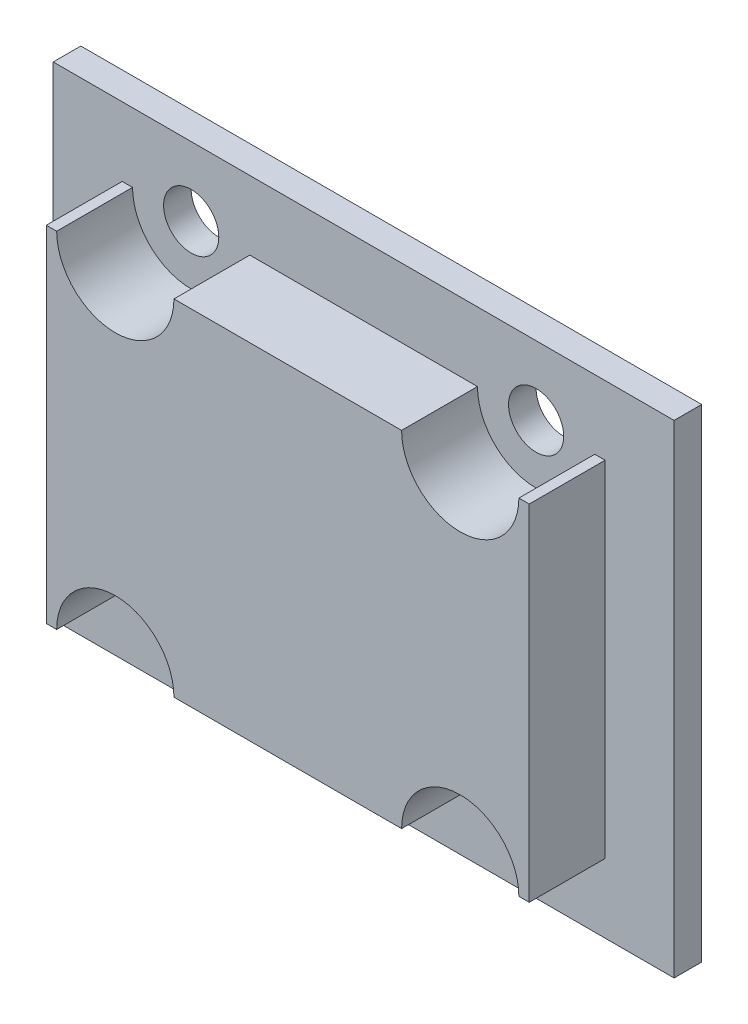
ISO-10303-21;
HEADER;
FILE_DESCRIPTION(('STEP AP214'),'2;1');
FILE_NAME('part.step','',(''),(''),'','','');
FILE_SCHEMA(('AUTOMOTIVE_DESIGN { 1 0 10303 214 1 1 1 1 }'));
ENDSEC;
DATA;
#1=APPLICATION_CONTEXT('core data for automotive mechanical design processes');
#2=APPLICATION_PROTOCOL_DEFINITION('international standard','automotive_design',2000,#1);
#3=PRODUCT_CONTEXT('',#1,'mechanical');
#4=PRODUCT('Part','Part','',(#3));
#5=PRODUCT_RELATED_PRODUCT_CATEGORY('part','',(#4));
#6=PRODUCT_DEFINITION_FORMATION('','',#4);
#7=PRODUCT_DEFINITION_CONTEXT('part definition',#1,'design');
#8=PRODUCT_DEFINITION('design','',#6,#7);
#9=PRODUCT_DEFINITION_SHAPE('','',#8);
#10=(LENGTH_UNIT() NAMED_UNIT(*) SI_UNIT(.MILLI.,.METRE.));
#11=(NAMED_UNIT(*) PLANE_ANGLE_UNIT() SI_UNIT($,.RADIAN.));
#12=(NAMED_UNIT(*) SI_UNIT($,.STERADIAN.) SOLID_ANGLE_UNIT());
#13=UNCERTAINTY_MEASURE_WITH_UNIT(LENGTH_MEASURE(1.E-05),#10,'distance_accuracy_value','');
#14=(GEOMETRIC_REPRESENTATION_CONTEXT(3) GLOBAL_UNCERTAINTY_ASSIGNED_CONTEXT((#13)) GLOBAL_UNIT_ASSIGNED_CONTEXT((#10,
#11,#12)) REPRESENTATION_CONTEXT('',''));
#15=CARTESIAN_POINT('',(0.,0.,0.));
#16=DIRECTION('',(0.,0.,1.));
#17=DIRECTION('',(1.,0.,0.));
#18=AXIS2_PLACEMENT_3D('',#15,#16,#17);
#19=CARTESIAN_POINT('',(0.,0.,19.));
#20=DIRECTION('',(0.,0.,1.));
#21=DIRECTION('',(1.,0.,0.));
#22=AXIS2_PLACEMENT_3D('',#19,#20,#21);
#23=PLANE('',#22);
#24=DIRECTION('',(-1.,0.,0.));
#25=VECTOR('',#24,1.);
#26=CARTESIAN_POINT('',(14.,10.,19.));
#27=LINE('',#26,#25);
#28=CARTESIAN_POINT('',(-13.4,10.,19.));
#29=VERTEX_POINT('',#28);
#30=CARTESIAN_POINT('',(-14.,10.,19.));
#31=VERTEX_POINT('',#30);
#32=EDGE_CURVE('E23',#29,#31,#27,.T.);
#33=ORIENTED_EDGE('',*,*,#32,.T.);
#34=DIRECTION('',(0.,-1.,0.));
#35=VECTOR('',#34,1.);
#36=CARTESIAN_POINT('',(-14.,10.,19.));
#37=LINE('',#36,#35);
#38=CARTESIAN_POINT('',(-14.,-10.,19.));
#39=VERTEX_POINT('',#38);
#40=EDGE_CURVE('E9',#31,#39,#37,.T.);
#41=ORIENTED_EDGE('',*,*,#40,.T.);
#42=DIRECTION('',(1.,0.,0.));
#43=VECTOR('',#42,1.);
#44=CARTESIAN_POINT('',(-14.,-10.,19.));
#45=LINE('',#44,#43);
#46=CARTESIAN_POINT('',(-13.4,-10.,19.));
#47=VERTEX_POINT('',#46);
#48=EDGE_CURVE('E249',#39,#47,#45,.T.);
#49=ORIENTED_EDGE('',*,*,#48,.T.);
#50=CARTESIAN_POINT('',(-10.,-10.,19.));
#51=DIRECTION('',(0.,0.,-1.));
#52=DIRECTION('',(1.,0.,0.));
#53=AXIS2_PLACEMENT_3D('',#50,#51,#52);
#54=CIRCLE('',#53,3.4);
#55=CARTESIAN_POINT('',(-6.6,-10.,19.));
#56=VERTEX_POINT('',#55);
#57=EDGE_CURVE('E337',#47,#56,#54,.T.);
#58=ORIENTED_EDGE('',*,*,#57,.T.);
#59=DIRECTION('',(1.,0.,0.));
#60=VECTOR('',#59,1.);
#61=CARTESIAN_POINT('',(-14.,-10.,19.));
#62=LINE('',#61,#60);
#63=CARTESIAN_POINT('',(6.6,-10.,19.));
#64=VERTEX_POINT('',#63);
#65=EDGE_CURVE('E234',#56,#64,#62,.T.);
#66=ORIENTED_EDGE('',*,*,#65,.T.);
#67=CARTESIAN_POINT('',(10.,-10.,19.));
#68=DIRECTION('',(0.,0.,-1.));
#69=DIRECTION('',(1.,0.,0.));
#70=AXIS2_PLACEMENT_3D('',#67,#68,#69);
#71=CIRCLE('',#70,3.4);
#72=CARTESIAN_POINT('',(13.4,-10.,19.));
#73=VERTEX_POINT('',#72);
#74=EDGE_CURVE('E375',#64,#73,#71,.T.);
#75=ORIENTED_EDGE('',*,*,#74,.T.);
#76=DIRECTION('',(1.,0.,0.));
#77=VECTOR('',#76,1.);
#78=CARTESIAN_POINT('',(-14.,-10.,19.));
#79=LINE('',#78,#77);
#80=CARTESIAN_POINT('',(14.,-10.,19.));
#81=VERTEX_POINT('',#80);
#82=EDGE_CURVE('E379',#73,#81,#79,.T.);
#83=ORIENTED_EDGE('',*,*,#82,.T.);
#84=DIRECTION('',(0.,1.,0.));
#85=VECTOR('',#84,1.);
#86=CARTESIAN_POINT('',(14.,-10.,19.));
#87=LINE('',#86,#85);
#88=CARTESIAN_POINT('',(14.,10.,19.));
#89=VERTEX_POINT('',#88);
#90=EDGE_CURVE('E389',#81,#89,#87,.T.);
#91=ORIENTED_EDGE('',*,*,#90,.T.);
#92=DIRECTION('',(-1.,0.,0.));
#93=VECTOR('',#92,1.);
#94=CARTESIAN_POINT('',(14.,10.,19.));
#95=LINE('',#94,#93);
#96=CARTESIAN_POINT('',(13.4,10.,19.));
#97=VERTEX_POINT('',#96);
#98=EDGE_CURVE('E396',#89,#97,#95,.T.);
#99=ORIENTED_EDGE('',*,*,#98,.T.);
#100=CARTESIAN_POINT('',(10.,10.,19.));
#101=DIRECTION('',(0.,0.,-1.));
#102=DIRECTION('',(1.,0.,0.));
#103=AXIS2_PLACEMENT_3D('',#100,#101,#102);
#104=CIRCLE('',#103,3.4);
#105=CARTESIAN_POINT('',(6.6,10.,19.));
#106=VERTEX_POINT('',#105);
#107=EDGE_CURVE('E403',#97,#106,#104,.T.);
#108=ORIENTED_EDGE('',*,*,#107,.T.);
#109=DIRECTION('',(-1.,0.,0.));
#110=VECTOR('',#109,1.);
#111=CARTESIAN_POINT('',(14.,10.,19.));
#112=LINE('',#111,#110);
#113=CARTESIAN_POINT('',(-6.6,10.,19.));
#114=VERTEX_POINT('',#113);
#115=EDGE_CURVE('E411',#106,#114,#112,.T.);
#116=ORIENTED_EDGE('',*,*,#115,.T.);
#117=CARTESIAN_POINT('',(-10.,10.,19.));
#118=DIRECTION('',(0.,0.,-1.));
#119=DIRECTION('',(1.,0.,0.));
#120=AXIS2_PLACEMENT_3D('',#117,#118,#119);
#121=CIRCLE('',#120,3.4);
#122=EDGE_CURVE('E416',#114,#29,#121,.T.);
#123=ORIENTED_EDGE('',*,*,#122,.T.);
#124=EDGE_LOOP('',(#33,#41,#49,#58,#66,#75,#83,#91,#99,#108,#116,#123));
#125=FACE_BOUND('',#124,.T.);
#126=ADVANCED_FACE('F15',(#125),#23,.T.);
#127=CARTESIAN_POINT('',(-14.,10.,14.6));
#128=DIRECTION('',(1.,0.,0.));
#129=DIRECTION('',(0.,1.,0.));
#130=AXIS2_PLACEMENT_3D('',#127,#128,#129);
#131=PLANE('',#130);
#132=DIRECTION('',(0.,-1.,0.));
#133=VECTOR('',#132,1.);
#134=CARTESIAN_POINT('',(-14.,10.,14.6));
#135=LINE('',#134,#133);
#136=CARTESIAN_POINT('',(-14.,10.,14.6));
#137=VERTEX_POINT('',#136);
#138=CARTESIAN_POINT('',(-14.,-10.,14.6));
#139=VERTEX_POINT('',#138);
#140=EDGE_CURVE('E298',#137,#139,#135,.T.);
#141=ORIENTED_EDGE('',*,*,#140,.T.);
#142=DIRECTION('',(0.,0.,1.));
#143=VECTOR('',#142,1.);
#144=CARTESIAN_POINT('',(-14.,-10.,14.6));
#145=LINE('',#144,#143);
#146=EDGE_CURVE('E255',#139,#39,#145,.T.);
#147=ORIENTED_EDGE('',*,*,#146,.T.);
#148=ORIENTED_EDGE('',*,*,#40,.F.);
#149=DIRECTION('',(0.,0.,1.));
#150=VECTOR('',#149,1.);
#151=CARTESIAN_POINT('',(-14.,10.,14.6));
#152=LINE('',#151,#150);
#153=EDGE_CURVE('E423',#137,#31,#152,.T.);
#154=ORIENTED_EDGE('',*,*,#153,.F.);
#155=EDGE_LOOP('',(#141,#147,#148,#154));
#156=FACE_BOUND('',#155,.T.);
#157=ADVANCED_FACE('F429',(#156),#131,.F.);
#158=CARTESIAN_POINT('',(14.,10.,14.6));
#159=DIRECTION('',(0.,-1.,0.));
#160=DIRECTION('',(0.,0.,-1.));
#161=AXIS2_PLACEMENT_3D('',#158,#159,#160);
#162=PLANE('',#161);
#163=ORIENTED_EDGE('',*,*,#153,.T.);
#164=ORIENTED_EDGE('',*,*,#32,.F.);
#165=DIRECTION('',(0.,0.,-1.));
#166=VECTOR('',#165,1.);
#167=CARTESIAN_POINT('',(-13.4,10.,13.));
#168=LINE('',#167,#166);
#169=CARTESIAN_POINT('',(-13.4,10.,14.6));
#170=VERTEX_POINT('',#169);
#171=EDGE_CURVE('E414',#29,#170,#168,.T.);
#172=ORIENTED_EDGE('',*,*,#171,.T.);
#173=DIRECTION('',(-1.,0.,0.));
#174=VECTOR('',#173,1.);
#175=CARTESIAN_POINT('',(14.,10.,14.6));
#176=LINE('',#175,#174);
#177=EDGE_CURVE('E309',#170,#137,#176,.T.);
#178=ORIENTED_EDGE('',*,*,#177,.T.);
#179=EDGE_LOOP('',(#163,#164,#172,#178));
#180=FACE_BOUND('',#179,.T.);
#181=ADVANCED_FACE('F430',(#180),#162,.F.);
#182=CARTESIAN_POINT('',(-10.,10.,13.));
#183=DIRECTION('',(0.,0.,-1.));
#184=DIRECTION('',(1.,0.,0.));
#185=AXIS2_PLACEMENT_3D('',#182,#183,#184);
#186=CYLINDRICAL_SURFACE('',#185,3.4);
#187=DIRECTION('',(0.,0.,1.));
#188=VECTOR('',#187,1.);
#189=CARTESIAN_POINT('',(-6.6,10.,13.));
#190=LINE('',#189,#188);
#191=CARTESIAN_POINT('',(-6.6,10.,14.6));
#192=VERTEX_POINT('',#191);
#193=EDGE_CURVE('E410',#192,#114,#190,.T.);
#194=ORIENTED_EDGE('',*,*,#193,.F.);
#195=CARTESIAN_POINT('',(-10.,10.,14.6));
#196=DIRECTION('',(0.,0.,-1.));
#197=DIRECTION('',(1.,0.,0.));
#198=AXIS2_PLACEMENT_3D('',#195,#196,#197);
#199=CIRCLE('',#198,3.4);
#200=EDGE_CURVE('E314',#192,#170,#199,.T.);
#201=ORIENTED_EDGE('',*,*,#200,.T.);
#202=ORIENTED_EDGE('',*,*,#171,.F.);
#203=ORIENTED_EDGE('',*,*,#122,.F.);
#204=EDGE_LOOP('',(#194,#201,#202,#203));
#205=FACE_BOUND('',#204,.T.);
#206=ADVANCED_FACE('F470',(#205),#186,.F.);
#207=CARTESIAN_POINT('',(14.,10.,14.6));
#208=DIRECTION('',(0.,-1.,0.));
#209=DIRECTION('',(0.,0.,-1.));
#210=AXIS2_PLACEMENT_3D('',#207,#208,#209);
#211=PLANE('',#210);
#212=ORIENTED_EDGE('',*,*,#193,.T.);
#213=ORIENTED_EDGE('',*,*,#115,.F.);
#214=DIRECTION('',(0.,0.,-1.));
#215=VECTOR('',#214,1.);
#216=CARTESIAN_POINT('',(6.6,10.,13.));
#217=LINE('',#216,#215);
#218=CARTESIAN_POINT('',(6.6,10.,14.6));
#219=VERTEX_POINT('',#218);
#220=EDGE_CURVE('E399',#106,#219,#217,.T.);
#221=ORIENTED_EDGE('',*,*,#220,.T.);
#222=DIRECTION('',(-1.,0.,0.));
#223=VECTOR('',#222,1.);
#224=CARTESIAN_POINT('',(14.,10.,14.6));
#225=LINE('',#224,#223);
#226=EDGE_CURVE('E318',#219,#192,#225,.T.);
#227=ORIENTED_EDGE('',*,*,#226,.T.);
#228=EDGE_LOOP('',(#212,#213,#221,#227));
#229=FACE_BOUND('',#228,.T.);
#230=ADVANCED_FACE('F463',(#229),#211,.F.);
#231=CARTESIAN_POINT('',(10.,10.,13.));
#232=DIRECTION('',(0.,0.,-1.));
#233=DIRECTION('',(1.,0.,0.));
#234=AXIS2_PLACEMENT_3D('',#231,#232,#233);
#235=CYLINDRICAL_SURFACE('',#234,3.4);
#236=DIRECTION('',(0.,0.,1.));
#237=VECTOR('',#236,1.);
#238=CARTESIAN_POINT('',(13.4,10.,13.));
#239=LINE('',#238,#237);
#240=CARTESIAN_POINT('',(13.4,10.,14.6));
#241=VERTEX_POINT('',#240);
#242=EDGE_CURVE('E392',#241,#97,#239,.T.);
#243=ORIENTED_EDGE('',*,*,#242,.F.);
#244=CARTESIAN_POINT('',(10.,10.,14.6));
#245=DIRECTION('',(0.,0.,-1.));
#246=DIRECTION('',(1.,0.,0.));
#247=AXIS2_PLACEMENT_3D('',#244,#245,#246);
#248=CIRCLE('',#247,3.4);
#249=EDGE_CURVE('E241',#241,#219,#248,.T.);
#250=ORIENTED_EDGE('',*,*,#249,.T.);
#251=ORIENTED_EDGE('',*,*,#220,.F.);
#252=ORIENTED_EDGE('',*,*,#107,.F.);
#253=EDGE_LOOP('',(#243,#250,#251,#252));
#254=FACE_BOUND('',#253,.T.);
#255=ADVANCED_FACE('F461',(#254),#235,.F.);
#256=CARTESIAN_POINT('',(14.,10.,14.6));
#257=DIRECTION('',(0.,-1.,0.));
#258=DIRECTION('',(0.,0.,-1.));
#259=AXIS2_PLACEMENT_3D('',#256,#257,#258);
#260=PLANE('',#259);
#261=ORIENTED_EDGE('',*,*,#242,.T.);
#262=ORIENTED_EDGE('',*,*,#98,.F.);
#263=DIRECTION('',(0.,0.,1.));
#264=VECTOR('',#263,1.);
#265=CARTESIAN_POINT('',(14.,10.,14.6));
#266=LINE('',#265,#264);
#267=CARTESIAN_POINT('',(14.,10.,14.6));
#268=VERTEX_POINT('',#267);
#269=EDGE_CURVE('E383',#268,#89,#266,.T.);
#270=ORIENTED_EDGE('',*,*,#269,.F.);
#271=DIRECTION('',(-1.,0.,0.));
#272=VECTOR('',#271,1.);
#273=CARTESIAN_POINT('',(14.,10.,14.6));
#274=LINE('',#273,#272);
#275=EDGE_CURVE('E240',#268,#241,#274,.T.);
#276=ORIENTED_EDGE('',*,*,#275,.T.);
#277=EDGE_LOOP('',(#261,#262,#270,#276));
#278=FACE_BOUND('',#277,.T.);
#279=ADVANCED_FACE('F456',(#278),#260,.F.);
#280=CARTESIAN_POINT('',(14.,-10.,14.6));
#281=DIRECTION('',(-1.,0.,0.));
#282=DIRECTION('',(0.,0.,1.));
#283=AXIS2_PLACEMENT_3D('',#280,#281,#282);
#284=PLANE('',#283);
#285=DIRECTION('',(0.,1.,0.));
#286=VECTOR('',#285,1.);
#287=CARTESIAN_POINT('',(14.,-10.,14.6));
#288=LINE('',#287,#286);
#289=CARTESIAN_POINT('',(14.,-10.,14.6));
#290=VERTEX_POINT('',#289);
#291=EDGE_CURVE('E239',#290,#268,#288,.T.);
#292=ORIENTED_EDGE('',*,*,#291,.T.);
#293=ORIENTED_EDGE('',*,*,#269,.T.);
#294=ORIENTED_EDGE('',*,*,#90,.F.);
#295=DIRECTION('',(0.,0.,1.));
#296=VECTOR('',#295,1.);
#297=CARTESIAN_POINT('',(14.,-10.,14.6));
#298=LINE('',#297,#296);
#299=EDGE_CURVE('E376',#290,#81,#298,.T.);
#300=ORIENTED_EDGE('',*,*,#299,.F.);
#301=EDGE_LOOP('',(#292,#293,#294,#300));
#302=FACE_BOUND('',#301,.T.);
#303=ADVANCED_FACE('F452',(#302),#284,.F.);
#304=CARTESIAN_POINT('',(-14.,-10.,14.6));
#305=DIRECTION('',(0.,1.,0.));
#306=DIRECTION('',(1.,0.,0.));
#307=AXIS2_PLACEMENT_3D('',#304,#305,#306);
#308=PLANE('',#307);
#309=ORIENTED_EDGE('',*,*,#299,.T.);
#310=ORIENTED_EDGE('',*,*,#82,.F.);
#311=DIRECTION('',(0.,0.,1.));
#312=VECTOR('',#311,1.);
#313=CARTESIAN_POINT('',(13.4,-10.,13.));
#314=LINE('',#313,#312);
#315=CARTESIAN_POINT('',(13.4,-10.,14.6));
#316=VERTEX_POINT('',#315);
#317=EDGE_CURVE('E232',#316,#73,#314,.T.);
#318=ORIENTED_EDGE('',*,*,#317,.F.);
#319=DIRECTION('',(1.,0.,0.));
#320=VECTOR('',#319,1.);
#321=CARTESIAN_POINT('',(-14.,-10.,14.6));
#322=LINE('',#321,#320);
#323=EDGE_CURVE('E327',#316,#290,#322,.T.);
#324=ORIENTED_EDGE('',*,*,#323,.T.);
#325=EDGE_LOOP('',(#309,#310,#318,#324));
#326=FACE_BOUND('',#325,.T.);
#327=ADVANCED_FACE('F451',(#326),#308,.F.);
#328=CARTESIAN_POINT('',(10.,-10.,13.));
#329=DIRECTION('',(0.,0.,-1.));
#330=DIRECTION('',(1.,0.,0.));
#331=AXIS2_PLACEMENT_3D('',#328,#329,#330);
#332=CYLINDRICAL_SURFACE('',#331,3.4);
#333=CARTESIAN_POINT('',(10.,-10.,14.6));
#334=DIRECTION('',(0.,0.,-1.));
#335=DIRECTION('',(1.,0.,0.));
#336=AXIS2_PLACEMENT_3D('',#333,#334,#335);
#337=CIRCLE('',#336,3.4);
#338=CARTESIAN_POINT('',(6.6,-10.,14.6));
#339=VERTEX_POINT('',#338);
#340=EDGE_CURVE('E335',#339,#316,#337,.T.);
#341=ORIENTED_EDGE('',*,*,#340,.T.);
#342=ORIENTED_EDGE('',*,*,#317,.T.);
#343=ORIENTED_EDGE('',*,*,#74,.F.);
#344=DIRECTION('',(0.,0.,-1.));
#345=VECTOR('',#344,1.);
#346=CARTESIAN_POINT('',(6.6,-10.,13.));
#347=LINE('',#346,#345);
#348=EDGE_CURVE('E231',#64,#339,#347,.T.);
#349=ORIENTED_EDGE('',*,*,#348,.T.);
#350=EDGE_LOOP('',(#341,#342,#343,#349));
#351=FACE_BOUND('',#350,.T.);
#352=ADVANCED_FACE('F449',(#351),#332,.F.);
#353=CARTESIAN_POINT('',(-14.,-10.,14.6));
#354=DIRECTION('',(0.,1.,0.));
#355=DIRECTION('',(1.,0.,0.));
#356=AXIS2_PLACEMENT_3D('',#353,#354,#355);
#357=PLANE('',#356);
#358=ORIENTED_EDGE('',*,*,#65,.F.);
#359=DIRECTION('',(0.,0.,1.));
#360=VECTOR('',#359,1.);
#361=CARTESIAN_POINT('',(-6.6,-10.,13.));
#362=LINE('',#361,#360);
#363=CARTESIAN_POINT('',(-6.6,-10.,14.6));
#364=VERTEX_POINT('',#363);
#365=EDGE_CURVE('E334',#364,#56,#362,.T.);
#366=ORIENTED_EDGE('',*,*,#365,.F.);
#367=DIRECTION('',(1.,0.,0.));
#368=VECTOR('',#367,1.);
#369=CARTESIAN_POINT('',(-14.,-10.,14.6));
#370=LINE('',#369,#368);
#371=EDGE_CURVE('E271',#364,#339,#370,.T.);
#372=ORIENTED_EDGE('',*,*,#371,.T.);
#373=ORIENTED_EDGE('',*,*,#348,.F.);
#374=EDGE_LOOP('',(#358,#366,#372,#373));
#375=FACE_BOUND('',#374,.T.);
#376=ADVANCED_FACE('F441',(#375),#357,.F.);
#377=CARTESIAN_POINT('',(-10.,-10.,13.));
#378=DIRECTION('',(0.,0.,-1.));
#379=DIRECTION('',(1.,0.,0.));
#380=AXIS2_PLACEMENT_3D('',#377,#378,#379);
#381=CYLINDRICAL_SURFACE('',#380,3.4);
#382=CARTESIAN_POINT('',(-10.,-10.,14.6));
#383=DIRECTION('',(0.,0.,-1.));
#384=DIRECTION('',(1.,0.,0.));
#385=AXIS2_PLACEMENT_3D('',#382,#383,#384);
#386=CIRCLE('',#385,3.4);
#387=CARTESIAN_POINT('',(-13.4,-10.,14.6));
#388=VERTEX_POINT('',#387);
#389=EDGE_CURVE('E266',#388,#364,#386,.T.);
#390=ORIENTED_EDGE('',*,*,#389,.T.);
#391=ORIENTED_EDGE('',*,*,#365,.T.);
#392=ORIENTED_EDGE('',*,*,#57,.F.);
#393=DIRECTION('',(0.,0.,-1.));
#394=VECTOR('',#393,1.);
#395=CARTESIAN_POINT('',(-13.4,-10.,13.));
#396=LINE('',#395,#394);
#397=EDGE_CURVE('E254',#47,#388,#396,.T.);
#398=ORIENTED_EDGE('',*,*,#397,.T.);
#399=EDGE_LOOP('',(#390,#391,#392,#398));
#400=FACE_BOUND('',#399,.T.);
#401=ADVANCED_FACE('F445',(#400),#381,.F.);
#402=CARTESIAN_POINT('',(-14.,-10.,14.6));
#403=DIRECTION('',(0.,1.,0.));
#404=DIRECTION('',(1.,0.,0.));
#405=AXIS2_PLACEMENT_3D('',#402,#403,#404);
#406=PLANE('',#405);
#407=ORIENTED_EDGE('',*,*,#397,.F.);
#408=ORIENTED_EDGE('',*,*,#48,.F.);
#409=ORIENTED_EDGE('',*,*,#146,.F.);
#410=DIRECTION('',(1.,0.,0.));
#411=VECTOR('',#410,1.);
#412=CARTESIAN_POINT('',(-14.,-10.,14.6));
#413=LINE('',#412,#411);
#414=EDGE_CURVE('E294',#139,#388,#413,.T.);
#415=ORIENTED_EDGE('',*,*,#414,.T.);
#416=EDGE_LOOP('',(#407,#408,#409,#415));
#417=FACE_BOUND('',#416,.T.);
#418=ADVANCED_FACE('F439',(#417),#406,.F.);
#419=CARTESIAN_POINT('',(10.,10.,12.));
#420=DIRECTION('',(0.,0.,-1.));
#421=DIRECTION('',(1.,0.,0.));
#422=AXIS2_PLACEMENT_3D('',#419,#420,#421);
#423=CYLINDRICAL_SURFACE('',#422,1.6);
#424=CARTESIAN_POINT('',(10.,10.,13.));
#425=DIRECTION('',(0.,0.,-1.));
#426=DIRECTION('',(1.,0.,0.));
#427=AXIS2_PLACEMENT_3D('',#424,#425,#426);
#428=CIRCLE('',#427,1.6);
#429=CARTESIAN_POINT('',(11.6,10.,13.));
#430=VERTEX_POINT('',#429);
#431=EDGE_CURVE('E243',#430,#430,#428,.T.);
#432=ORIENTED_EDGE('',*,*,#431,.T.);
#433=DIRECTION('',(0.,0.,1.));
#434=VECTOR('',#433,1.);
#435=CARTESIAN_POINT('',(11.6,10.,12.));
#436=LINE('',#435,#434);
#437=CARTESIAN_POINT('',(11.6,10.,14.6));
#438=VERTEX_POINT('',#437);
#439=EDGE_CURVE('E356',#430,#438,#436,.T.);
#440=ORIENTED_EDGE('',*,*,#439,.T.);
#441=CARTESIAN_POINT('',(10.,10.,14.6));
#442=DIRECTION('',(0.,0.,-1.));
#443=DIRECTION('',(1.,0.,0.));
#444=AXIS2_PLACEMENT_3D('',#441,#442,#443);
#445=CIRCLE('',#444,1.6);
#446=EDGE_CURVE('E269',#438,#438,#445,.T.);
#447=ORIENTED_EDGE('',*,*,#446,.F.);
#448=ORIENTED_EDGE('',*,*,#439,.F.);
#449=EDGE_LOOP('',(#432,#440,#447,#448));
#450=FACE_BOUND('',#449,.T.);
#451=ADVANCED_FACE('F569',(#450),#423,.F.);
#452=CARTESIAN_POINT('',(-10.,10.,12.));
#453=DIRECTION('',(0.,0.,-1.));
#454=DIRECTION('',(1.,0.,0.));
#455=AXIS2_PLACEMENT_3D('',#452,#453,#454);
#456=CYLINDRICAL_SURFACE('',#455,1.6);
#457=CARTESIAN_POINT('',(-10.,10.,13.));
#458=DIRECTION('',(0.,0.,-1.));
#459=DIRECTION('',(1.,0.,0.));
#460=AXIS2_PLACEMENT_3D('',#457,#458,#459);
#461=CIRCLE('',#460,1.6);
#462=CARTESIAN_POINT('',(-8.4,10.,13.));
#463=VERTEX_POINT('',#462);
#464=EDGE_CURVE('E248',#463,#463,#461,.T.);
#465=ORIENTED_EDGE('',*,*,#464,.T.);
#466=DIRECTION('',(0.,0.,1.));
#467=VECTOR('',#466,1.);
#468=CARTESIAN_POINT('',(-8.4,10.,12.));
#469=LINE('',#468,#467);
#470=CARTESIAN_POINT('',(-8.4,10.,14.6));
#471=VERTEX_POINT('',#470);
#472=EDGE_CURVE('E352',#463,#471,#469,.T.);
#473=ORIENTED_EDGE('',*,*,#472,.T.);
#474=CARTESIAN_POINT('',(-10.,10.,14.6));
#475=DIRECTION('',(0.,0.,-1.));
#476=DIRECTION('',(1.,0.,0.));
#477=AXIS2_PLACEMENT_3D('',#474,#475,#476);
#478=CIRCLE('',#477,1.6);
#479=EDGE_CURVE('E299',#471,#471,#478,.T.);
#480=ORIENTED_EDGE('',*,*,#479,.F.);
#481=ORIENTED_EDGE('',*,*,#472,.F.);
#482=EDGE_LOOP('',(#465,#473,#480,#481));
#483=FACE_BOUND('',#482,.T.);
#484=ADVANCED_FACE('F578',(#483),#456,.F.);
#485=CARTESIAN_POINT('',(10.,-10.,12.));
#486=DIRECTION('',(0.,0.,-1.));
#487=DIRECTION('',(1.,0.,0.));
#488=AXIS2_PLACEMENT_3D('',#485,#486,#487);
#489=CYLINDRICAL_SURFACE('',#488,1.6);
#490=CARTESIAN_POINT('',(10.,-10.,13.));
#491=DIRECTION('',(0.,0.,-1.));
#492=DIRECTION('',(1.,0.,0.));
#493=AXIS2_PLACEMENT_3D('',#490,#491,#492);
#494=CIRCLE('',#493,1.6);
#495=CARTESIAN_POINT('',(11.6,-10.,13.));
#496=VERTEX_POINT('',#495);
#497=EDGE_CURVE('E281',#496,#496,#494,.T.);
#498=ORIENTED_EDGE('',*,*,#497,.T.);
#499=DIRECTION('',(0.,0.,1.));
#500=VECTOR('',#499,1.);
#501=CARTESIAN_POINT('',(11.6,-10.,12.));
#502=LINE('',#501,#500);
#503=CARTESIAN_POINT('',(11.6,-10.,14.6));
#504=VERTEX_POINT('',#503);
#505=EDGE_CURVE('E349',#496,#504,#502,.T.);
#506=ORIENTED_EDGE('',*,*,#505,.T.);
#507=CARTESIAN_POINT('',(10.,-10.,14.6));
#508=DIRECTION('',(0.,0.,-1.));
#509=DIRECTION('',(1.,0.,0.));
#510=AXIS2_PLACEMENT_3D('',#507,#508,#509);
#511=CIRCLE('',#510,1.6);
#512=EDGE_CURVE('E292',#504,#504,#511,.T.);
#513=ORIENTED_EDGE('',*,*,#512,.F.);
#514=ORIENTED_EDGE('',*,*,#505,.F.);
#515=EDGE_LOOP('',(#498,#506,#513,#514));
#516=FACE_BOUND('',#515,.T.);
#517=ADVANCED_FACE('F589',(#516),#489,.F.);
#518=CARTESIAN_POINT('',(-10.,-10.,12.));
#519=DIRECTION('',(0.,0.,-1.));
#520=DIRECTION('',(1.,0.,0.));
#521=AXIS2_PLACEMENT_3D('',#518,#519,#520);
#522=CYLINDRICAL_SURFACE('',#521,1.6);
#523=CARTESIAN_POINT('',(-10.,-10.,13.));
#524=DIRECTION('',(0.,0.,-1.));
#525=DIRECTION('',(1.,0.,0.));
#526=AXIS2_PLACEMENT_3D('',#523,#524,#525);
#527=CIRCLE('',#526,1.6);
#528=CARTESIAN_POINT('',(-8.4,-10.,13.));
#529=VERTEX_POINT('',#528);
#530=EDGE_CURVE('E256',#529,#529,#527,.T.);
#531=ORIENTED_EDGE('',*,*,#530,.T.);
#532=DIRECTION('',(0.,0.,1.));
#533=VECTOR('',#532,1.);
#534=CARTESIAN_POINT('',(-8.4,-10.,12.));
#535=LINE('',#534,#533);
#536=CARTESIAN_POINT('',(-8.4,-10.,14.6));
#537=VERTEX_POINT('',#536);
#538=EDGE_CURVE('E346',#529,#537,#535,.T.);
#539=ORIENTED_EDGE('',*,*,#538,.T.);
#540=CARTESIAN_POINT('',(-10.,-10.,14.6));
#541=DIRECTION('',(0.,0.,-1.));
#542=DIRECTION('',(1.,0.,0.));
#543=AXIS2_PLACEMENT_3D('',#540,#541,#542);
#544=CIRCLE('',#543,1.6);
#545=EDGE_CURVE('E289',#537,#537,#544,.T.);
#546=ORIENTED_EDGE('',*,*,#545,.F.);
#547=ORIENTED_EDGE('',*,*,#538,.F.);
#548=EDGE_LOOP('',(#531,#539,#546,#547));
#549=FACE_BOUND('',#548,.T.);
#550=ADVANCED_FACE('F601',(#549),#522,.F.);
#551=CARTESIAN_POINT('',(18.,14.,13.));
#552=DIRECTION('',(0.,-1.,0.));
#553=DIRECTION('',(0.,0.,-1.));
#554=AXIS2_PLACEMENT_3D('',#551,#552,#553);
#555=PLANE('',#554);
#556=DIRECTION('',(-1.,0.,0.));
#557=VECTOR('',#556,1.);
#558=CARTESIAN_POINT('',(18.,14.,13.));
#559=LINE('',#558,#557);
#560=CARTESIAN_POINT('',(18.,14.,13.));
#561=VERTEX_POINT('',#560);
#562=CARTESIAN_POINT('',(-18.,14.,13.));
#563=VERTEX_POINT('',#562);
#564=EDGE_CURVE('E258',#561,#563,#559,.T.);
#565=ORIENTED_EDGE('',*,*,#564,.T.);
#566=DIRECTION('',(0.,0.,1.));
#567=VECTOR('',#566,1.);
#568=CARTESIAN_POINT('',(-18.,14.,13.));
#569=LINE('',#568,#567);
#570=CARTESIAN_POINT('',(-18.,14.,14.6));
#571=VERTEX_POINT('',#570);
#572=EDGE_CURVE('E201',#563,#571,#569,.T.);
#573=ORIENTED_EDGE('',*,*,#572,.T.);
#574=DIRECTION('',(-1.,0.,0.));
#575=VECTOR('',#574,1.);
#576=CARTESIAN_POINT('',(18.,14.,14.6));
#577=LINE('',#576,#575);
#578=CARTESIAN_POINT('',(18.,14.,14.6));
#579=VERTEX_POINT('',#578);
#580=EDGE_CURVE('E250',#579,#571,#577,.T.);
#581=ORIENTED_EDGE('',*,*,#580,.F.);
#582=DIRECTION('',(0.,0.,1.));
#583=VECTOR('',#582,1.);
#584=CARTESIAN_POINT('',(18.,14.,13.));
#585=LINE('',#584,#583);
#586=EDGE_CURVE('E263',#561,#579,#585,.T.);
#587=ORIENTED_EDGE('',*,*,#586,.F.);
#588=EDGE_LOOP('',(#565,#573,#581,#587));
#589=FACE_BOUND('',#588,.T.);
#590=ADVANCED_FACE('F611',(#589),#555,.F.);
#591=CARTESIAN_POINT('',(0.,0.,14.6));
#592=DIRECTION('',(0.,0.,1.));
#593=DIRECTION('',(1.,0.,0.));
#594=AXIS2_PLACEMENT_3D('',#591,#592,#593);
#595=PLANE('',#594);
#596=ORIENTED_EDGE('',*,*,#446,.T.);
#597=EDGE_LOOP('',(#596));
#598=FACE_BOUND('',#597,.T.);
#599=ORIENTED_EDGE('',*,*,#414,.F.);
#600=ORIENTED_EDGE('',*,*,#140,.F.);
#601=ORIENTED_EDGE('',*,*,#177,.F.);
#602=ORIENTED_EDGE('',*,*,#200,.F.);
#603=ORIENTED_EDGE('',*,*,#226,.F.);
#604=ORIENTED_EDGE('',*,*,#249,.F.);
#605=ORIENTED_EDGE('',*,*,#275,.F.);
#606=ORIENTED_EDGE('',*,*,#291,.F.);
#607=ORIENTED_EDGE('',*,*,#323,.F.);
#608=ORIENTED_EDGE('',*,*,#340,.F.);
#609=ORIENTED_EDGE('',*,*,#371,.F.);
#610=ORIENTED_EDGE('',*,*,#389,.F.);
#611=EDGE_LOOP('',(#599,#600,#601,#602,#603,#604,#605,#606,#607,#608,#609,#610));
#612=FACE_BOUND('',#611,.T.);
#613=ORIENTED_EDGE('',*,*,#479,.T.);
#614=EDGE_LOOP('',(#613));
#615=FACE_BOUND('',#614,.T.);
#616=ORIENTED_EDGE('',*,*,#512,.T.);
#617=EDGE_LOOP('',(#616));
#618=FACE_BOUND('',#617,.T.);
#619=ORIENTED_EDGE('',*,*,#545,.T.);
#620=EDGE_LOOP('',(#619));
#621=FACE_BOUND('',#620,.T.);
#622=DIRECTION('',(1.,0.,0.));
#623=VECTOR('',#622,1.);
#624=CARTESIAN_POINT('',(-18.,-14.,14.6));
#625=LINE('',#624,#623);
#626=CARTESIAN_POINT('',(-18.,-14.,14.6));
#627=VERTEX_POINT('',#626);
#628=CARTESIAN_POINT('',(18.,-14.,14.6));
#629=VERTEX_POINT('',#628);
#630=EDGE_CURVE('E214',#627,#629,#625,.T.);
#631=ORIENTED_EDGE('',*,*,#630,.T.);
#632=DIRECTION('',(0.,1.,0.));
#633=VECTOR('',#632,1.);
#634=CARTESIAN_POINT('',(18.,-14.,14.6));
#635=LINE('',#634,#633);
#636=EDGE_CURVE('E259',#629,#579,#635,.T.);
#637=ORIENTED_EDGE('',*,*,#636,.T.);
#638=ORIENTED_EDGE('',*,*,#580,.T.);
#639=DIRECTION('',(0.,-1.,0.));
#640=VECTOR('',#639,1.);
#641=CARTESIAN_POINT('',(-18.,14.,14.6));
#642=LINE('',#641,#640);
#643=EDGE_CURVE('E210',#571,#627,#642,.T.);
#644=ORIENTED_EDGE('',*,*,#643,.T.);
#645=EDGE_LOOP('',(#631,#637,#638,#644));
#646=FACE_BOUND('',#645,.T.);
#647=ADVANCED_FACE('F434',(#598,#612,#615,#618,#621,#646),#595,.T.);
#648=CARTESIAN_POINT('',(0.,0.,13.));
#649=DIRECTION('',(0.,0.,1.));
#650=DIRECTION('',(1.,0.,0.));
#651=AXIS2_PLACEMENT_3D('',#648,#649,#650);
#652=PLANE('',#651);
#653=ORIENTED_EDGE('',*,*,#431,.F.);
#654=EDGE_LOOP('',(#653));
#655=FACE_BOUND('',#654,.T.);
#656=ORIENTED_EDGE('',*,*,#464,.F.);
#657=EDGE_LOOP('',(#656));
#658=FACE_BOUND('',#657,.T.);
#659=ORIENTED_EDGE('',*,*,#497,.F.);
#660=EDGE_LOOP('',(#659));
#661=FACE_BOUND('',#660,.T.);
#662=ORIENTED_EDGE('',*,*,#530,.F.);
#663=EDGE_LOOP('',(#662));
#664=FACE_BOUND('',#663,.T.);
#665=DIRECTION('',(0.,-1.,0.));
#666=VECTOR('',#665,1.);
#667=CARTESIAN_POINT('',(-18.,14.,13.));
#668=LINE('',#667,#666);
#669=CARTESIAN_POINT('',(-18.,-14.,13.));
#670=VERTEX_POINT('',#669);
#671=EDGE_CURVE('E198',#563,#670,#668,.T.);
#672=ORIENTED_EDGE('',*,*,#671,.F.);
#673=ORIENTED_EDGE('',*,*,#564,.F.);
#674=DIRECTION('',(0.,1.,0.));
#675=VECTOR('',#674,1.);
#676=CARTESIAN_POINT('',(18.,-14.,13.));
#677=LINE('',#676,#675);
#678=CARTESIAN_POINT('',(18.,-14.,13.));
#679=VERTEX_POINT('',#678);
#680=EDGE_CURVE('E219',#679,#561,#677,.T.);
#681=ORIENTED_EDGE('',*,*,#680,.F.);
#682=DIRECTION('',(1.,0.,0.));
#683=VECTOR('',#682,1.);
#684=CARTESIAN_POINT('',(-18.,-14.,13.));
#685=LINE('',#684,#683);
#686=EDGE_CURVE('E213',#670,#679,#685,.T.);
#687=ORIENTED_EDGE('',*,*,#686,.F.);
#688=EDGE_LOOP('',(#672,#673,#681,#687));
#689=FACE_BOUND('',#688,.T.);
#690=ADVANCED_FACE('F217',(#655,#658,#661,#664,#689),#652,.F.);
#691=CARTESIAN_POINT('',(18.,-14.,13.));
#692=DIRECTION('',(-1.,0.,0.));
#693=DIRECTION('',(0.,0.,1.));
#694=AXIS2_PLACEMENT_3D('',#691,#692,#693);
#695=PLANE('',#694);
#696=ORIENTED_EDGE('',*,*,#680,.T.);
#697=ORIENTED_EDGE('',*,*,#586,.T.);
#698=ORIENTED_EDGE('',*,*,#636,.F.);
#699=DIRECTION('',(0.,0.,1.));
#700=VECTOR('',#699,1.);
#701=CARTESIAN_POINT('',(18.,-14.,13.));
#702=LINE('',#701,#700);
#703=EDGE_CURVE('E224',#679,#629,#702,.T.);
#704=ORIENTED_EDGE('',*,*,#703,.F.);
#705=EDGE_LOOP('',(#696,#697,#698,#704));
#706=FACE_BOUND('',#705,.T.);
#707=ADVANCED_FACE('F640',(#706),#695,.F.);
#708=CARTESIAN_POINT('',(-18.,14.,13.));
#709=DIRECTION('',(1.,0.,0.));
#710=DIRECTION('',(0.,1.,0.));
#711=AXIS2_PLACEMENT_3D('',#708,#709,#710);
#712=PLANE('',#711);
#713=ORIENTED_EDGE('',*,*,#671,.T.);
#714=DIRECTION('',(0.,0.,1.));
#715=VECTOR('',#714,1.);
#716=CARTESIAN_POINT('',(-18.,-14.,13.));
#717=LINE('',#716,#715);
#718=EDGE_CURVE('E199',#670,#627,#717,.T.);
#719=ORIENTED_EDGE('',*,*,#718,.T.);
#720=ORIENTED_EDGE('',*,*,#643,.F.);
#721=ORIENTED_EDGE('',*,*,#572,.F.);
#722=EDGE_LOOP('',(#713,#719,#720,#721));
#723=FACE_BOUND('',#722,.T.);
#724=ADVANCED_FACE('F196',(#723),#712,.F.);
#725=CARTESIAN_POINT('',(-18.,-14.,13.));
#726=DIRECTION('',(0.,1.,0.));
#727=DIRECTION('',(1.,0.,0.));
#728=AXIS2_PLACEMENT_3D('',#725,#726,#727);
#729=PLANE('',#728);
#730=ORIENTED_EDGE('',*,*,#686,.T.);
#731=ORIENTED_EDGE('',*,*,#703,.T.);
#732=ORIENTED_EDGE('',*,*,#630,.F.);
#733=ORIENTED_EDGE('',*,*,#718,.F.);
#734=EDGE_LOOP('',(#730,#731,#732,#733));
#735=FACE_BOUND('',#734,.T.);
#736=ADVANCED_FACE('F211',(#735),#729,.F.);
#737=CLOSED_SHELL('',(#126,#157,#181,#206,#230,#255,#279,#303,#327,#352,#376,#401,#418,#451,
#484,#517,#550,#590,#647,#690,#707,#724,#736));
#738=MANIFOLD_SOLID_BREP('B1',#737);
#739=ADVANCED_BREP_SHAPE_REPRESENTATION('',(#18,#738),#14);
#740=SHAPE_DEFINITION_REPRESENTATION(#9,#739);
ENDSEC;
END-ISO-10303-21;
